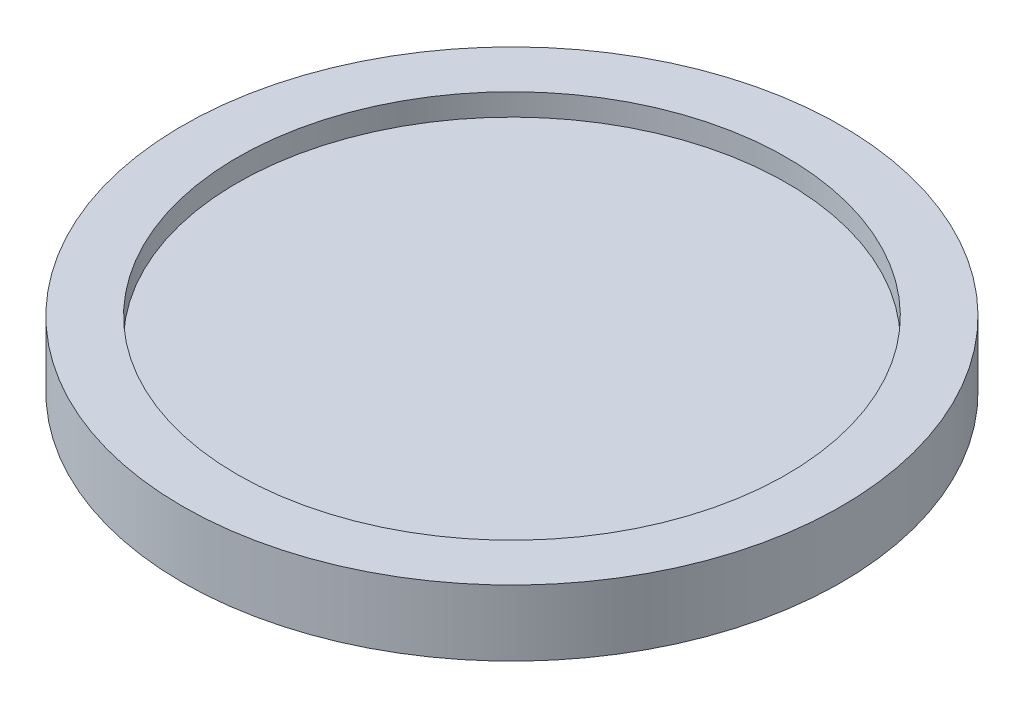
ISO-10303-21;
HEADER;
FILE_DESCRIPTION(('STEP AP214'),'2;1');
FILE_NAME('part.step','',(''),(''),'','','');
FILE_SCHEMA(('AUTOMOTIVE_DESIGN { 1 0 10303 214 1 1 1 1 }'));
ENDSEC;
DATA;
#1=APPLICATION_CONTEXT('core data for automotive mechanical design processes');
#2=APPLICATION_PROTOCOL_DEFINITION('international standard','automotive_design',2000,#1);
#3=PRODUCT_CONTEXT('',#1,'mechanical');
#4=PRODUCT('Part','Part','',(#3));
#5=PRODUCT_RELATED_PRODUCT_CATEGORY('part','',(#4));
#6=PRODUCT_DEFINITION_FORMATION('','',#4);
#7=PRODUCT_DEFINITION_CONTEXT('part definition',#1,'design');
#8=PRODUCT_DEFINITION('design','',#6,#7);
#9=PRODUCT_DEFINITION_SHAPE('','',#8);
#10=(LENGTH_UNIT() NAMED_UNIT(*) SI_UNIT(.MILLI.,.METRE.));
#11=(NAMED_UNIT(*) PLANE_ANGLE_UNIT() SI_UNIT($,.RADIAN.));
#12=(NAMED_UNIT(*) SI_UNIT($,.STERADIAN.) SOLID_ANGLE_UNIT());
#13=UNCERTAINTY_MEASURE_WITH_UNIT(LENGTH_MEASURE(1.E-05),#10,'distance_accuracy_value','');
#14=(GEOMETRIC_REPRESENTATION_CONTEXT(3) GLOBAL_UNCERTAINTY_ASSIGNED_CONTEXT((#13)) GLOBAL_UNIT_ASSIGNED_CONTEXT((#10,
#11,#12)) REPRESENTATION_CONTEXT('',''));
#15=CARTESIAN_POINT('',(0.,0.,0.));
#16=DIRECTION('',(0.,0.,1.));
#17=DIRECTION('',(1.,0.,0.));
#18=AXIS2_PLACEMENT_3D('',#15,#16,#17);
#19=CARTESIAN_POINT('',(0.,6.,0.));
#20=DIRECTION('',(0.,-1.,0.));
#21=DIRECTION('',(0.,0.,-1.));
#22=AXIS2_PLACEMENT_3D('',#19,#20,#21);
#23=CYLINDRICAL_SURFACE('',#22,30.);
#24=CARTESIAN_POINT('',(0.,6.,0.));
#25=DIRECTION('',(0.,1.,0.));
#26=DIRECTION('',(0.,0.,1.));
#27=AXIS2_PLACEMENT_3D('',#24,#25,#26);
#28=CIRCLE('',#27,30.);
#29=CARTESIAN_POINT('',(0.,6.,30.));
#30=VERTEX_POINT('',#29);
#31=EDGE_CURVE('E10',#30,#30,#28,.T.);
#32=ORIENTED_EDGE('',*,*,#31,.F.);
#33=EDGE_LOOP('',(#32));
#34=FACE_BOUND('',#33,.T.);
#35=CARTESIAN_POINT('',(0.,0.,0.));
#36=DIRECTION('',(0.,1.,0.));
#37=DIRECTION('',(0.,0.,1.));
#38=AXIS2_PLACEMENT_3D('',#35,#36,#37);
#39=CIRCLE('',#38,30.);
#40=CARTESIAN_POINT('',(0.,0.,30.));
#41=VERTEX_POINT('',#40);
#42=EDGE_CURVE('E43',#41,#41,#39,.T.);
#43=ORIENTED_EDGE('',*,*,#42,.T.);
#44=EDGE_LOOP('',(#43));
#45=FACE_BOUND('',#44,.T.);
#46=ADVANCED_FACE('F40',(#34,#45),#23,.T.);
#47=CARTESIAN_POINT('',(0.,6.,0.));
#48=DIRECTION('',(0.,1.,0.));
#49=DIRECTION('',(0.,0.,1.));
#50=AXIS2_PLACEMENT_3D('',#47,#48,#49);
#51=PLANE('',#50);
#52=CARTESIAN_POINT('',(0.,6.,0.));
#53=DIRECTION('',(0.,1.,0.));
#54=DIRECTION('',(0.,0.,1.));
#55=AXIS2_PLACEMENT_3D('',#52,#53,#54);
#56=CIRCLE('',#55,25.);
#57=CARTESIAN_POINT('',(0.,6.,25.));
#58=VERTEX_POINT('',#57);
#59=EDGE_CURVE('E63',#58,#58,#56,.T.);
#60=ORIENTED_EDGE('',*,*,#59,.F.);
#61=EDGE_LOOP('',(#60));
#62=FACE_BOUND('',#61,.T.);
#63=ORIENTED_EDGE('',*,*,#31,.T.);
#64=EDGE_LOOP('',(#63));
#65=FACE_BOUND('',#64,.T.);
#66=ADVANCED_FACE('F125',(#62,#65),#51,.T.);
#67=CARTESIAN_POINT('',(0.,0.,0.));
#68=DIRECTION('',(0.,1.,0.));
#69=DIRECTION('',(0.,0.,1.));
#70=AXIS2_PLACEMENT_3D('',#67,#68,#69);
#71=PLANE('',#70);
#72=CARTESIAN_POINT('',(0.,0.,0.));
#73=DIRECTION('',(0.,-1.,0.));
#74=DIRECTION('',(0.,0.,-1.));
#75=AXIS2_PLACEMENT_3D('',#72,#73,#74);
#76=CIRCLE('',#75,25.);
#77=CARTESIAN_POINT('',(0.,0.,-25.));
#78=VERTEX_POINT('',#77);
#79=EDGE_CURVE('E55',#78,#78,#76,.T.);
#80=ORIENTED_EDGE('',*,*,#79,.F.);
#81=EDGE_LOOP('',(#80));
#82=FACE_BOUND('',#81,.T.);
#83=ORIENTED_EDGE('',*,*,#42,.F.);
#84=EDGE_LOOP('',(#83));
#85=FACE_BOUND('',#84,.T.);
#86=ADVANCED_FACE('F119',(#82,#85),#71,.F.);
#87=CARTESIAN_POINT('',(0.,2.,0.));
#88=DIRECTION('',(0.,-1.,0.));
#89=DIRECTION('',(0.,0.,-1.));
#90=AXIS2_PLACEMENT_3D('',#87,#88,#89);
#91=CYLINDRICAL_SURFACE('',#90,25.);
#92=CARTESIAN_POINT('',(0.,2.,0.));
#93=DIRECTION('',(0.,-1.,0.));
#94=DIRECTION('',(0.,0.,-1.));
#95=AXIS2_PLACEMENT_3D('',#92,#93,#94);
#96=CIRCLE('',#95,25.);
#97=CARTESIAN_POINT('',(0.,2.,-25.));
#98=VERTEX_POINT('',#97);
#99=EDGE_CURVE('E53',#98,#98,#96,.T.);
#100=ORIENTED_EDGE('',*,*,#99,.F.);
#101=EDGE_LOOP('',(#100));
#102=FACE_BOUND('',#101,.T.);
#103=ORIENTED_EDGE('',*,*,#79,.T.);
#104=EDGE_LOOP('',(#103));
#105=FACE_BOUND('',#104,.T.);
#106=ADVANCED_FACE('F113',(#102,#105),#91,.F.);
#107=CARTESIAN_POINT('',(0.,2.,0.));
#108=DIRECTION('',(0.,-1.,0.));
#109=DIRECTION('',(0.,0.,-1.));
#110=AXIS2_PLACEMENT_3D('',#107,#108,#109);
#111=PLANE('',#110);
#112=CARTESIAN_POINT('',(0.,2.,0.));
#113=DIRECTION('',(0.,-1.,0.));
#114=DIRECTION('',(0.,0.,-1.));
#115=AXIS2_PLACEMENT_3D('',#112,#113,#114);
#116=CIRCLE('',#115,6.);
#117=CARTESIAN_POINT('',(0.,2.,-6.));
#118=VERTEX_POINT('',#117);
#119=EDGE_CURVE('E71',#118,#118,#116,.T.);
#120=ORIENTED_EDGE('',*,*,#119,.F.);
#121=EDGE_LOOP('',(#120));
#122=FACE_BOUND('',#121,.T.);
#123=ORIENTED_EDGE('',*,*,#99,.T.);
#124=EDGE_LOOP('',(#123));
#125=FACE_BOUND('',#124,.T.);
#126=ADVANCED_FACE('F109',(#122,#125),#111,.T.);
#127=CARTESIAN_POINT('',(0.,4.,0.));
#128=DIRECTION('',(0.,1.,0.));
#129=DIRECTION('',(0.,0.,1.));
#130=AXIS2_PLACEMENT_3D('',#127,#128,#129);
#131=CYLINDRICAL_SURFACE('',#130,25.);
#132=CARTESIAN_POINT('',(0.,4.,0.));
#133=DIRECTION('',(0.,1.,0.));
#134=DIRECTION('',(0.,0.,1.));
#135=AXIS2_PLACEMENT_3D('',#132,#133,#134);
#136=CIRCLE('',#135,25.);
#137=CARTESIAN_POINT('',(0.,4.,25.));
#138=VERTEX_POINT('',#137);
#139=EDGE_CURVE('E59',#138,#138,#136,.T.);
#140=ORIENTED_EDGE('',*,*,#139,.F.);
#141=EDGE_LOOP('',(#140));
#142=FACE_BOUND('',#141,.T.);
#143=ORIENTED_EDGE('',*,*,#59,.T.);
#144=EDGE_LOOP('',(#143));
#145=FACE_BOUND('',#144,.T.);
#146=ADVANCED_FACE('F112',(#142,#145),#131,.F.);
#147=CARTESIAN_POINT('',(0.,4.,0.));
#148=DIRECTION('',(0.,1.,0.));
#149=DIRECTION('',(0.,0.,1.));
#150=AXIS2_PLACEMENT_3D('',#147,#148,#149);
#151=PLANE('',#150);
#152=ORIENTED_EDGE('',*,*,#139,.T.);
#153=EDGE_LOOP('',(#152));
#154=FACE_BOUND('',#153,.T.);
#155=ADVANCED_FACE('F105',(#154),#151,.T.);
#156=CARTESIAN_POINT('',(0.,-8.,0.));
#157=DIRECTION('',(0.,1.,0.));
#158=DIRECTION('',(0.,0.,1.));
#159=AXIS2_PLACEMENT_3D('',#156,#157,#158);
#160=CYLINDRICAL_SURFACE('',#159,6.);
#161=CARTESIAN_POINT('',(0.,-8.,0.));
#162=DIRECTION('',(0.,-1.,0.));
#163=DIRECTION('',(0.,0.,-1.));
#164=AXIS2_PLACEMENT_3D('',#161,#162,#163);
#165=CIRCLE('',#164,6.);
#166=CARTESIAN_POINT('',(0.,-8.,-6.));
#167=VERTEX_POINT('',#166);
#168=EDGE_CURVE('E67',#167,#167,#165,.T.);
#169=ORIENTED_EDGE('',*,*,#168,.F.);
#170=EDGE_LOOP('',(#169));
#171=FACE_BOUND('',#170,.T.);
#172=ORIENTED_EDGE('',*,*,#119,.T.);
#173=EDGE_LOOP('',(#172));
#174=FACE_BOUND('',#173,.T.);
#175=ADVANCED_FACE('F99',(#171,#174),#160,.T.);
#176=CARTESIAN_POINT('',(0.,-8.,0.));
#177=DIRECTION('',(0.,-1.,0.));
#178=DIRECTION('',(0.,0.,-1.));
#179=AXIS2_PLACEMENT_3D('',#176,#177,#178);
#180=PLANE('',#179);
#181=CARTESIAN_POINT('',(0.,-8.,0.));
#182=DIRECTION('',(0.,-1.,0.));
#183=DIRECTION('',(0.,0.,-1.));
#184=AXIS2_PLACEMENT_3D('',#181,#182,#183);
#185=CIRCLE('',#184,2.);
#186=CARTESIAN_POINT('',(0.,-8.,-2.));
#187=VERTEX_POINT('',#186);
#188=EDGE_CURVE('E79',#187,#187,#185,.T.);
#189=ORIENTED_EDGE('',*,*,#188,.F.);
#190=EDGE_LOOP('',(#189));
#191=FACE_BOUND('',#190,.T.);
#192=ORIENTED_EDGE('',*,*,#168,.T.);
#193=EDGE_LOOP('',(#192));
#194=FACE_BOUND('',#193,.T.);
#195=ADVANCED_FACE('F93',(#191,#194),#180,.T.);
#196=CARTESIAN_POINT('',(0.,2.,0.));
#197=DIRECTION('',(0.,-1.,0.));
#198=DIRECTION('',(0.,0.,-1.));
#199=AXIS2_PLACEMENT_3D('',#196,#197,#198);
#200=CYLINDRICAL_SURFACE('',#199,2.);
#201=CARTESIAN_POINT('',(0.,2.,0.));
#202=DIRECTION('',(0.,-1.,0.));
#203=DIRECTION('',(0.,0.,-1.));
#204=AXIS2_PLACEMENT_3D('',#201,#202,#203);
#205=CIRCLE('',#204,2.);
#206=CARTESIAN_POINT('',(0.,2.,-2.));
#207=VERTEX_POINT('',#206);
#208=EDGE_CURVE('E75',#207,#207,#205,.T.);
#209=ORIENTED_EDGE('',*,*,#208,.F.);
#210=EDGE_LOOP('',(#209));
#211=FACE_BOUND('',#210,.T.);
#212=ORIENTED_EDGE('',*,*,#188,.T.);
#213=EDGE_LOOP('',(#212));
#214=FACE_BOUND('',#213,.T.);
#215=ADVANCED_FACE('F90',(#211,#214),#200,.F.);
#216=CARTESIAN_POINT('',(0.,2.,0.));
#217=DIRECTION('',(0.,-1.,0.));
#218=DIRECTION('',(0.,0.,-1.));
#219=AXIS2_PLACEMENT_3D('',#216,#217,#218);
#220=PLANE('',#219);
#221=ORIENTED_EDGE('',*,*,#208,.T.);
#222=EDGE_LOOP('',(#221));
#223=FACE_BOUND('',#222,.T.);
#224=ADVANCED_FACE('F88',(#223),#220,.T.);
#225=CLOSED_SHELL('',(#46,#66,#86,#106,#126,#146,#155,#175,#195,#215,#224));
#226=MANIFOLD_SOLID_BREP('B2',#225);
#227=ADVANCED_BREP_SHAPE_REPRESENTATION('',(#18,#226),#14);
#228=SHAPE_DEFINITION_REPRESENTATION(#9,#227);
ENDSEC;
END-ISO-10303-21;
